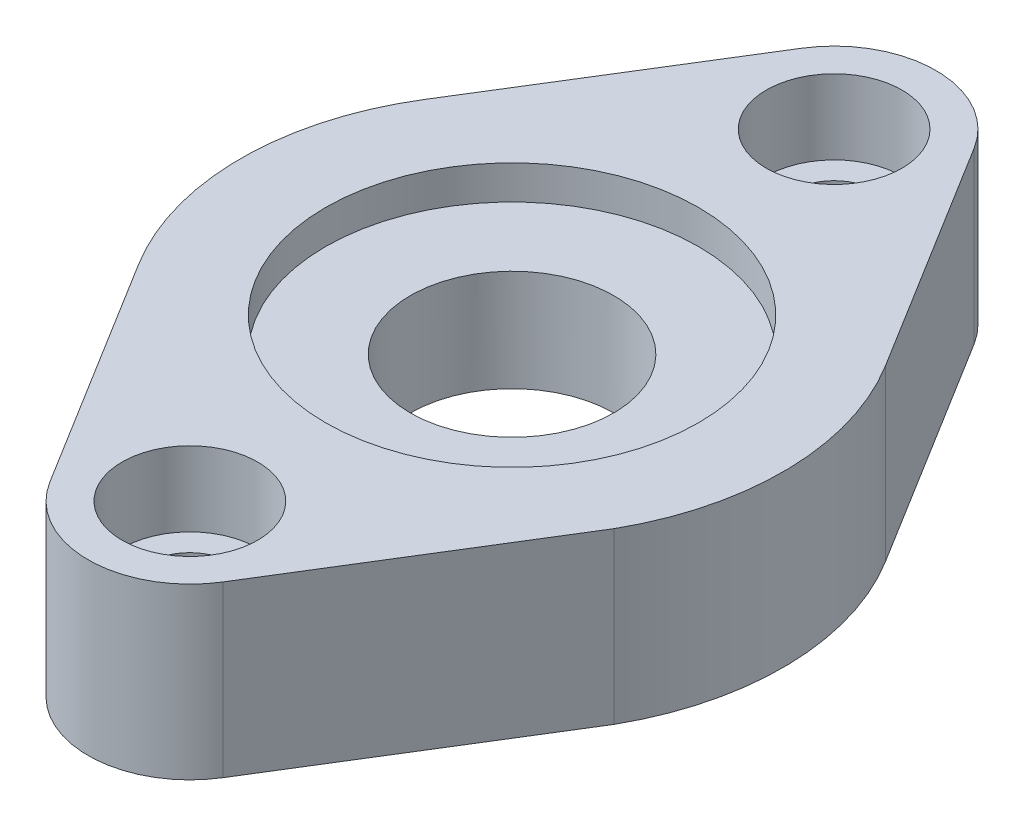
ISO-10303-21;
HEADER;
FILE_DESCRIPTION(('STEP AP214'),'2;1');
FILE_NAME('part.step','',(''),(''),'','','');
FILE_SCHEMA(('AUTOMOTIVE_DESIGN { 1 0 10303 214 1 1 1 1 }'));
ENDSEC;
DATA;
#1=APPLICATION_CONTEXT('core data for automotive mechanical design processes');
#2=APPLICATION_PROTOCOL_DEFINITION('international standard','automotive_design',2000,#1);
#3=PRODUCT_CONTEXT('',#1,'mechanical');
#4=PRODUCT('Part','Part','',(#3));
#5=PRODUCT_RELATED_PRODUCT_CATEGORY('part','',(#4));
#6=PRODUCT_DEFINITION_FORMATION('','',#4);
#7=PRODUCT_DEFINITION_CONTEXT('part definition',#1,'design');
#8=PRODUCT_DEFINITION('design','',#6,#7);
#9=PRODUCT_DEFINITION_SHAPE('','',#8);
#10=(LENGTH_UNIT() NAMED_UNIT(*) SI_UNIT(.MILLI.,.METRE.));
#11=(NAMED_UNIT(*) PLANE_ANGLE_UNIT() SI_UNIT($,.RADIAN.));
#12=(NAMED_UNIT(*) SI_UNIT($,.STERADIAN.) SOLID_ANGLE_UNIT());
#13=UNCERTAINTY_MEASURE_WITH_UNIT(LENGTH_MEASURE(1.E-05),#10,'distance_accuracy_value','');
#14=(GEOMETRIC_REPRESENTATION_CONTEXT(3) GLOBAL_UNCERTAINTY_ASSIGNED_CONTEXT((#13)) GLOBAL_UNIT_ASSIGNED_CONTEXT((#10,
#11,#12)) REPRESENTATION_CONTEXT('',''));
#15=CARTESIAN_POINT('',(0.,0.,0.));
#16=DIRECTION('',(0.,0.,1.));
#17=DIRECTION('',(1.,0.,0.));
#18=AXIS2_PLACEMENT_3D('',#15,#16,#17);
#19=CARTESIAN_POINT('',(0.,-0.000999999999999265,0.));
#20=DIRECTION('',(0.,1.,0.));
#21=DIRECTION('',(0.,0.,1.));
#22=AXIS2_PLACEMENT_3D('',#19,#20,#21);
#23=CYLINDRICAL_SURFACE('',#22,6.);
#24=CARTESIAN_POINT('',(0.,8.,0.));
#25=DIRECTION('',(0.,1.,0.));
#26=DIRECTION('',(0.,0.,1.));
#27=AXIS2_PLACEMENT_3D('',#24,#25,#26);
#28=CIRCLE('',#27,6.);
#29=CARTESIAN_POINT('',(0.,8.,6.));
#30=VERTEX_POINT('',#29);
#31=EDGE_CURVE('E212',#30,#30,#28,.T.);
#32=ORIENTED_EDGE('',*,*,#31,.T.);
#33=EDGE_LOOP('',(#32));
#34=FACE_BOUND('',#33,.T.);
#35=CARTESIAN_POINT('',(0.,2.,0.));
#36=DIRECTION('',(0.,-1.,0.));
#37=DIRECTION('',(0.,0.,-1.));
#38=AXIS2_PLACEMENT_3D('',#35,#36,#37);
#39=CIRCLE('',#38,6.);
#40=CARTESIAN_POINT('',(0.,2.,-6.));
#41=VERTEX_POINT('',#40);
#42=EDGE_CURVE('E42',#41,#41,#39,.F.);
#43=ORIENTED_EDGE('',*,*,#42,.F.);
#44=EDGE_LOOP('',(#43));
#45=FACE_BOUND('',#44,.T.);
#46=ADVANCED_FACE('F38',(#34,#45),#23,.F.);
#47=CARTESIAN_POINT('',(-0.0012658460579653,10.,0.00184899376610635));
#48=DIRECTION('',(0.,-1.,0.));
#49=DIRECTION('',(0.,0.,-1.));
#50=AXIS2_PLACEMENT_3D('',#47,#48,#49);
#51=CYLINDRICAL_SURFACE('',#50,16.0000844481188);
#52=CARTESIAN_POINT('',(-0.0012658460579653,0.,0.00184899376610635));
#53=DIRECTION('',(0.,1.,0.));
#54=DIRECTION('',(0.,0.,1.));
#55=AXIS2_PLACEMENT_3D('',#52,#53,#54);
#56=CIRCLE('',#55,16.0000844481188);
#57=CARTESIAN_POINT('',(13.912148596547,0.,7.90245662199601));
#58=VERTEX_POINT('',#57);
#59=CARTESIAN_POINT('',(13.6034825018068,0.,-8.41916785327805));
#60=VERTEX_POINT('',#59);
#61=EDGE_CURVE('E136',#58,#60,#56,.T.);
#62=ORIENTED_EDGE('',*,*,#61,.T.);
#63=DIRECTION('',(0.,-1.,0.));
#64=VECTOR('',#63,1.);
#65=CARTESIAN_POINT('',(13.6034825018068,10.,-8.41916785327805));
#66=LINE('',#65,#64);
#67=CARTESIAN_POINT('',(13.6034825018068,10.,-8.41916785327805));
#68=VERTEX_POINT('',#67);
#69=EDGE_CURVE('E11',#68,#60,#66,.T.);
#70=ORIENTED_EDGE('',*,*,#69,.F.);
#71=CARTESIAN_POINT('',(-0.0012658460579653,10.,0.00184899376610635));
#72=DIRECTION('',(0.,1.,0.));
#73=DIRECTION('',(0.,0.,1.));
#74=AXIS2_PLACEMENT_3D('',#71,#72,#73);
#75=CIRCLE('',#74,16.0000844481188);
#76=CARTESIAN_POINT('',(13.912148596547,10.,7.90245662199601));
#77=VERTEX_POINT('',#76);
#78=EDGE_CURVE('E151',#77,#68,#75,.T.);
#79=ORIENTED_EDGE('',*,*,#78,.F.);
#80=DIRECTION('',(0.,-1.,0.));
#81=VECTOR('',#80,1.);
#82=CARTESIAN_POINT('',(13.912148596547,10.,7.90245662199601));
#83=LINE('',#82,#81);
#84=EDGE_CURVE('E132',#77,#58,#83,.T.);
#85=ORIENTED_EDGE('',*,*,#84,.T.);
#86=EDGE_LOOP('',(#62,#70,#79,#85));
#87=FACE_BOUND('',#86,.T.);
#88=ADVANCED_FACE('F40',(#87),#51,.T.);
#89=CARTESIAN_POINT('',(5.10059070221827,10.,-22.1560099650156));
#90=DIRECTION('',(-0.85028918021674,0.,0.526315789242869));
#91=DIRECTION('',(0.526315789242869,0.,0.85028918021674));
#92=AXIS2_PLACEMENT_3D('',#89,#90,#91);
#93=PLANE('',#92);
#94=DIRECTION('',(-0.526315789242869,0.,-0.85028918021674));
#95=VECTOR('',#94,1.);
#96=CARTESIAN_POINT('',(5.10059070221827,0.,-22.1560099650156));
#97=LINE('',#96,#95);
#98=CARTESIAN_POINT('',(5.10059070221827,0.,-22.1560099650156));
#99=VERTEX_POINT('',#98);
#100=EDGE_CURVE('E139',#60,#99,#97,.T.);
#101=ORIENTED_EDGE('',*,*,#100,.T.);
#102=DIRECTION('',(0.,-1.,0.));
#103=VECTOR('',#102,1.);
#104=CARTESIAN_POINT('',(5.10059070221827,10.,-22.1560099650156));
#105=LINE('',#104,#103);
#106=CARTESIAN_POINT('',(5.10059070221827,10.,-22.1560099650156));
#107=VERTEX_POINT('',#106);
#108=EDGE_CURVE('E48',#107,#99,#105,.T.);
#109=ORIENTED_EDGE('',*,*,#108,.F.);
#110=DIRECTION('',(-0.526315789242869,0.,-0.85028918021674));
#111=VECTOR('',#110,1.);
#112=CARTESIAN_POINT('',(5.10059070221827,10.,-22.1560099650156));
#113=LINE('',#112,#111);
#114=EDGE_CURVE('E99',#68,#107,#113,.T.);
#115=ORIENTED_EDGE('',*,*,#114,.F.);
#116=ORIENTED_EDGE('',*,*,#69,.T.);
#117=EDGE_LOOP('',(#101,#109,#115,#116));
#118=FACE_BOUND('',#117,.T.);
#119=ADVANCED_FACE('F235',(#118),#93,.F.);
#120=CARTESIAN_POINT('',(-0.00121389778695734,10.,-18.9980670863549));
#121=DIRECTION('',(0.,-1.,0.));
#122=DIRECTION('',(0.,0.,-1.));
#123=AXIS2_PLACEMENT_3D('',#120,#121,#122);
#124=CYLINDRICAL_SURFACE('',#123,6.00008444953222);
#125=CARTESIAN_POINT('',(-0.00121389778695734,0.,-18.9980670863549));
#126=DIRECTION('',(0.,1.,0.));
#127=DIRECTION('',(0.,0.,-1.));
#128=AXIS2_PLACEMENT_3D('',#125,#126,#127);
#129=CIRCLE('',#128,6.00008444953222);
#130=CARTESIAN_POINT('',(-5.10301976364808,0.,-22.1560079199652));
#131=VERTEX_POINT('',#130);
#132=EDGE_CURVE('E142',#99,#131,#129,.T.);
#133=ORIENTED_EDGE('',*,*,#132,.T.);
#134=DIRECTION('',(0.,-1.,0.));
#135=VECTOR('',#134,1.);
#136=CARTESIAN_POINT('',(-5.10301976364808,10.,-22.1560079199652));
#137=LINE('',#136,#135);
#138=CARTESIAN_POINT('',(-5.10301976364808,10.,-22.1560079199652));
#139=VERTEX_POINT('',#138);
#140=EDGE_CURVE('E158',#139,#131,#137,.T.);
#141=ORIENTED_EDGE('',*,*,#140,.F.);
#142=CARTESIAN_POINT('',(-0.00121389778695734,10.,-18.9980670863549));
#143=DIRECTION('',(0.,1.,0.));
#144=DIRECTION('',(0.,0.,-1.));
#145=AXIS2_PLACEMENT_3D('',#142,#143,#144);
#146=CIRCLE('',#145,6.00008444953222);
#147=EDGE_CURVE('E167',#107,#139,#146,.T.);
#148=ORIENTED_EDGE('',*,*,#147,.F.);
#149=ORIENTED_EDGE('',*,*,#108,.T.);
#150=EDGE_LOOP('',(#133,#141,#148,#149));
#151=FACE_BOUND('',#150,.T.);
#152=ADVANCED_FACE('F165',(#151),#124,.T.);
#153=CARTESIAN_POINT('',(-5.10301976364808,10.,-22.1560079199652));
#154=DIRECTION('',(0.850289180073869,0.,0.526315789473684));
#155=DIRECTION('',(0.526315789473684,0.,-0.850289180073869));
#156=AXIS2_PLACEMENT_3D('',#153,#154,#155);
#157=PLANE('',#156);
#158=DIRECTION('',(-0.526315789473684,0.,0.850289180073869));
#159=VECTOR('',#158,1.);
#160=CARTESIAN_POINT('',(-5.10301976364808,0.,-22.1560079199652));
#161=LINE('',#160,#159);
#162=CARTESIAN_POINT('',(-13.6059115669656,0.,-8.41916581053581));
#163=VERTEX_POINT('',#162);
#164=EDGE_CURVE('E144',#131,#163,#161,.T.);
#165=ORIENTED_EDGE('',*,*,#164,.T.);
#166=DIRECTION('',(0.,-1.,0.));
#167=VECTOR('',#166,1.);
#168=CARTESIAN_POINT('',(-13.6059115669656,10.,-8.41916581053581));
#169=LINE('',#168,#167);
#170=CARTESIAN_POINT('',(-13.6059115669656,10.,-8.41916581053581));
#171=VERTEX_POINT('',#170);
#172=EDGE_CURVE('E155',#171,#163,#169,.T.);
#173=ORIENTED_EDGE('',*,*,#172,.F.);
#174=DIRECTION('',(-0.526315789473684,0.,0.850289180073869));
#175=VECTOR('',#174,1.);
#176=CARTESIAN_POINT('',(-5.10301976364808,10.,-22.1560079199652));
#177=LINE('',#176,#175);
#178=EDGE_CURVE('E179',#139,#171,#177,.T.);
#179=ORIENTED_EDGE('',*,*,#178,.F.);
#180=ORIENTED_EDGE('',*,*,#140,.T.);
#181=EDGE_LOOP('',(#165,#173,#179,#180));
#182=FACE_BOUND('',#181,.T.);
#183=ADVANCED_FACE('F175',(#182),#157,.F.);
#184=CARTESIAN_POINT('',(-0.0012658460579653,10.,0.00184899376610635));
#185=DIRECTION('',(0.,-1.,0.));
#186=DIRECTION('',(0.,0.,-1.));
#187=AXIS2_PLACEMENT_3D('',#184,#185,#186);
#188=CYLINDRICAL_SURFACE('',#187,15.9999961101771);
#189=CARTESIAN_POINT('',(-0.0012658460579653,0.,0.00184899376610635));
#190=DIRECTION('',(0.,1.,0.));
#191=DIRECTION('',(0.,0.,1.));
#192=AXIS2_PLACEMENT_3D('',#189,#190,#191);
#193=CIRCLE('',#192,15.9999961101771);
#194=CARTESIAN_POINT('',(-13.605722541643,0.,8.42316917195874));
#195=VERTEX_POINT('',#194);
#196=EDGE_CURVE('E146',#163,#195,#193,.T.);
#197=ORIENTED_EDGE('',*,*,#196,.T.);
#198=DIRECTION('',(0.,-1.,0.));
#199=VECTOR('',#198,1.);
#200=CARTESIAN_POINT('',(-13.605722541643,10.,8.42316917195874));
#201=LINE('',#200,#199);
#202=CARTESIAN_POINT('',(-13.605722541643,10.,8.42316917195874));
#203=VERTEX_POINT('',#202);
#204=EDGE_CURVE('E127',#203,#195,#201,.T.);
#205=ORIENTED_EDGE('',*,*,#204,.F.);
#206=CARTESIAN_POINT('',(-0.0012658460579653,10.,0.00184899376610635));
#207=DIRECTION('',(0.,1.,0.));
#208=DIRECTION('',(0.,0.,1.));
#209=AXIS2_PLACEMENT_3D('',#206,#207,#208);
#210=CIRCLE('',#209,15.9999961101771);
#211=EDGE_CURVE('E118',#171,#203,#210,.T.);
#212=ORIENTED_EDGE('',*,*,#211,.F.);
#213=ORIENTED_EDGE('',*,*,#172,.T.);
#214=EDGE_LOOP('',(#197,#205,#212,#213));
#215=FACE_BOUND('',#214,.T.);
#216=ADVANCED_FACE('F178',(#215),#188,.T.);
#217=CARTESIAN_POINT('',(-13.605722541643,10.,8.42316917195875));
#218=DIRECTION('',(0.850281854016254,0.,-0.526327624897916));
#219=DIRECTION('',(-0.526327624897916,0.,-0.850281854016255));
#220=AXIS2_PLACEMENT_3D('',#217,#218,#219);
#221=PLANE('',#220);
#222=DIRECTION('',(0.526327624897916,0.,0.850281854016254));
#223=VECTOR('',#222,1.);
#224=CARTESIAN_POINT('',(-13.605722541643,0.,8.42316917195875));
#225=LINE('',#224,#223);
#226=CARTESIAN_POINT('',(-5.10267553701801,0.,22.1598347579275));
#227=VERTEX_POINT('',#226);
#228=EDGE_CURVE('E126',#195,#227,#225,.T.);
#229=ORIENTED_EDGE('',*,*,#228,.T.);
#230=DIRECTION('',(0.,-1.,0.));
#231=VECTOR('',#230,1.);
#232=CARTESIAN_POINT('',(-5.10267553701801,10.,22.1598347579275));
#233=LINE('',#232,#231);
#234=CARTESIAN_POINT('',(-5.10267553701801,10.,22.1598347579275));
#235=VERTEX_POINT('',#234);
#236=EDGE_CURVE('E123',#235,#227,#233,.T.);
#237=ORIENTED_EDGE('',*,*,#236,.F.);
#238=DIRECTION('',(0.526327624897916,0.,0.850281854016254));
#239=VECTOR('',#238,1.);
#240=CARTESIAN_POINT('',(-13.605722541643,10.,8.42316917195875));
#241=LINE('',#240,#239);
#242=EDGE_CURVE('E112',#203,#235,#241,.T.);
#243=ORIENTED_EDGE('',*,*,#242,.F.);
#244=ORIENTED_EDGE('',*,*,#204,.T.);
#245=EDGE_LOOP('',(#229,#237,#243,#244));
#246=FACE_BOUND('',#245,.T.);
#247=ADVANCED_FACE('F124',(#246),#221,.F.);
#248=CARTESIAN_POINT('',(-0.00104409685265237,10.,19.0019329132658));
#249=DIRECTION('',(0.,-1.,0.));
#250=DIRECTION('',(0.,0.,-1.));
#251=AXIS2_PLACEMENT_3D('',#248,#249,#250);
#252=CYLINDRICAL_SURFACE('',#251,5.99991561705676);
#253=CARTESIAN_POINT('',(-0.00104409685265237,0.,19.0019329132658));
#254=DIRECTION('',(0.,1.,0.));
#255=DIRECTION('',(0.,0.,1.));
#256=AXIS2_PLACEMENT_3D('',#253,#254,#255);
#257=CIRCLE('',#256,5.99991561705676);
#258=CARTESIAN_POINT('',(5.10161433204634,0.,22.1581750411431));
#259=VERTEX_POINT('',#258);
#260=EDGE_CURVE('E85',#227,#259,#257,.T.);
#261=ORIENTED_EDGE('',*,*,#260,.T.);
#262=DIRECTION('',(0.,-1.,0.));
#263=VECTOR('',#262,1.);
#264=CARTESIAN_POINT('',(5.10161433204634,10.,22.1581750411431));
#265=LINE('',#264,#263);
#266=CARTESIAN_POINT('',(5.10161433204634,10.,22.1581750411431));
#267=VERTEX_POINT('',#266);
#268=EDGE_CURVE('E128',#267,#259,#265,.T.);
#269=ORIENTED_EDGE('',*,*,#268,.F.);
#270=CARTESIAN_POINT('',(-0.00104409685265237,10.,19.0019329132658));
#271=DIRECTION('',(0.,1.,0.));
#272=DIRECTION('',(0.,0.,1.));
#273=AXIS2_PLACEMENT_3D('',#270,#271,#272);
#274=CIRCLE('',#273,5.99991561705676);
#275=EDGE_CURVE('E116',#235,#267,#274,.T.);
#276=ORIENTED_EDGE('',*,*,#275,.F.);
#277=ORIENTED_EDGE('',*,*,#236,.T.);
#278=EDGE_LOOP('',(#261,#269,#276,#277));
#279=FACE_BOUND('',#278,.T.);
#280=ADVANCED_FACE('F130',(#279),#252,.T.);
#281=CARTESIAN_POINT('',(5.10161433204634,10.,22.1581750411431));
#282=DIRECTION('',(-0.850650388122401,0.,-0.525731792064364));
#283=DIRECTION('',(-0.525731792064364,0.,0.850650388122401));
#284=AXIS2_PLACEMENT_3D('',#281,#282,#283);
#285=PLANE('',#284);
#286=DIRECTION('',(0.525731792064364,0.,-0.850650388122401));
#287=VECTOR('',#286,1.);
#288=CARTESIAN_POINT('',(5.10161433204634,0.,22.1581750411431));
#289=LINE('',#288,#287);
#290=EDGE_CURVE('E91',#259,#58,#289,.T.);
#291=ORIENTED_EDGE('',*,*,#290,.T.);
#292=ORIENTED_EDGE('',*,*,#84,.F.);
#293=DIRECTION('',(0.525731792064364,0.,-0.850650388122401));
#294=VECTOR('',#293,1.);
#295=CARTESIAN_POINT('',(5.10161433204634,10.,22.1581750411431));
#296=LINE('',#295,#294);
#297=EDGE_CURVE('E56',#267,#77,#296,.T.);
#298=ORIENTED_EDGE('',*,*,#297,.F.);
#299=ORIENTED_EDGE('',*,*,#268,.T.);
#300=EDGE_LOOP('',(#291,#292,#298,#299));
#301=FACE_BOUND('',#300,.T.);
#302=ADVANCED_FACE('F275',(#301),#285,.F.);
#303=CARTESIAN_POINT('',(-0.0012658460579653,10.,0.00184899376610635));
#304=DIRECTION('',(0.,1.,0.));
#305=DIRECTION('',(0.,0.,1.));
#306=AXIS2_PLACEMENT_3D('',#303,#304,#305);
#307=PLANE('',#306);
#308=CARTESIAN_POINT('',(0.,10.,0.));
#309=DIRECTION('',(0.,1.,0.));
#310=DIRECTION('',(0.,0.,1.));
#311=AXIS2_PLACEMENT_3D('',#308,#309,#310);
#312=CIRCLE('',#311,11.);
#313=CARTESIAN_POINT('',(0.,10.,11.));
#314=VERTEX_POINT('',#313);
#315=EDGE_CURVE('E209',#314,#314,#312,.T.);
#316=ORIENTED_EDGE('',*,*,#315,.F.);
#317=EDGE_LOOP('',(#316));
#318=FACE_BOUND('',#317,.T.);
#319=CARTESIAN_POINT('',(-0.00121389778695734,10.,-18.9980670863549));
#320=DIRECTION('',(0.,1.,0.));
#321=DIRECTION('',(0.,0.,1.));
#322=AXIS2_PLACEMENT_3D('',#319,#320,#321);
#323=CIRCLE('',#322,3.99997531016157);
#324=CARTESIAN_POINT('',(-0.00121389778695734,10.,-14.9980917761933));
#325=VERTEX_POINT('',#324);
#326=EDGE_CURVE('E192',#325,#325,#323,.T.);
#327=ORIENTED_EDGE('',*,*,#326,.F.);
#328=EDGE_LOOP('',(#327));
#329=FACE_BOUND('',#328,.T.);
#330=CARTESIAN_POINT('',(-6.82170363509448E-05,10.,19.0018484509596));
#331=DIRECTION('',(0.,1.,0.));
#332=DIRECTION('',(0.,0.,1.));
#333=AXIS2_PLACEMENT_3D('',#330,#331,#332);
#334=CIRCLE('',#333,4.);
#335=CARTESIAN_POINT('',(-6.82170363509448E-05,10.,23.0018484509596));
#336=VERTEX_POINT('',#335);
#337=EDGE_CURVE('E188',#336,#336,#334,.T.);
#338=ORIENTED_EDGE('',*,*,#337,.F.);
#339=EDGE_LOOP('',(#338));
#340=FACE_BOUND('',#339,.T.);
#341=ORIENTED_EDGE('',*,*,#78,.T.);
#342=ORIENTED_EDGE('',*,*,#114,.T.);
#343=ORIENTED_EDGE('',*,*,#147,.T.);
#344=ORIENTED_EDGE('',*,*,#178,.T.);
#345=ORIENTED_EDGE('',*,*,#211,.T.);
#346=ORIENTED_EDGE('',*,*,#242,.T.);
#347=ORIENTED_EDGE('',*,*,#275,.T.);
#348=ORIENTED_EDGE('',*,*,#297,.T.);
#349=EDGE_LOOP('',(#341,#342,#343,#344,#345,#346,#347,#348));
#350=FACE_BOUND('',#349,.T.);
#351=ADVANCED_FACE('F114',(#318,#329,#340,#350),#307,.T.);
#352=CARTESIAN_POINT('',(-0.0012658460579653,0.,0.00184899376610635));
#353=DIRECTION('',(0.,1.,0.));
#354=DIRECTION('',(0.,0.,1.));
#355=AXIS2_PLACEMENT_3D('',#352,#353,#354);
#356=PLANE('',#355);
#357=CARTESIAN_POINT('',(0.,0.,0.));
#358=DIRECTION('',(0.,-1.,0.));
#359=DIRECTION('',(0.,0.,-1.));
#360=AXIS2_PLACEMENT_3D('',#357,#358,#359);
#361=CIRCLE('',#360,11.);
#362=CARTESIAN_POINT('',(0.,0.,-11.));
#363=VERTEX_POINT('',#362);
#364=EDGE_CURVE('E217',#363,#363,#361,.T.);
#365=ORIENTED_EDGE('',*,*,#364,.F.);
#366=EDGE_LOOP('',(#365));
#367=FACE_BOUND('',#366,.T.);
#368=CARTESIAN_POINT('',(-0.00121389778695734,0.,-18.9980670863549));
#369=DIRECTION('',(0.,1.,0.));
#370=DIRECTION('',(0.,0.,1.));
#371=AXIS2_PLACEMENT_3D('',#368,#369,#370);
#372=CIRCLE('',#371,2.5);
#373=CARTESIAN_POINT('',(-0.00121389778695734,0.,-16.4980670863549));
#374=VERTEX_POINT('',#373);
#375=EDGE_CURVE('E189',#374,#374,#372,.F.);
#376=ORIENTED_EDGE('',*,*,#375,.F.);
#377=EDGE_LOOP('',(#376));
#378=FACE_BOUND('',#377,.T.);
#379=CARTESIAN_POINT('',(-6.82170363509448E-05,0.,19.0018484509596));
#380=DIRECTION('',(0.,1.,0.));
#381=DIRECTION('',(0.,0.,1.));
#382=AXIS2_PLACEMENT_3D('',#379,#380,#381);
#383=CIRCLE('',#382,2.5);
#384=CARTESIAN_POINT('',(-6.82170363509448E-05,0.,21.5018484509596));
#385=VERTEX_POINT('',#384);
#386=EDGE_CURVE('E201',#385,#385,#383,.F.);
#387=ORIENTED_EDGE('',*,*,#386,.F.);
#388=EDGE_LOOP('',(#387));
#389=FACE_BOUND('',#388,.T.);
#390=ORIENTED_EDGE('',*,*,#61,.F.);
#391=ORIENTED_EDGE('',*,*,#290,.F.);
#392=ORIENTED_EDGE('',*,*,#260,.F.);
#393=ORIENTED_EDGE('',*,*,#228,.F.);
#394=ORIENTED_EDGE('',*,*,#196,.F.);
#395=ORIENTED_EDGE('',*,*,#164,.F.);
#396=ORIENTED_EDGE('',*,*,#132,.F.);
#397=ORIENTED_EDGE('',*,*,#100,.F.);
#398=EDGE_LOOP('',(#390,#391,#392,#393,#394,#395,#396,#397));
#399=FACE_BOUND('',#398,.T.);
#400=ADVANCED_FACE('F171',(#367,#378,#389,#399),#356,.F.);
#401=CARTESIAN_POINT('',(-6.82170363509448E-05,5.6,19.0018484509596));
#402=DIRECTION('',(0.,1.,0.));
#403=DIRECTION('',(0.,0.,1.));
#404=AXIS2_PLACEMENT_3D('',#401,#402,#403);
#405=CYLINDRICAL_SURFACE('',#404,4.);
#406=CARTESIAN_POINT('',(-6.82170363509448E-05,5.6,19.0018484509596));
#407=DIRECTION('',(0.,1.,0.));
#408=DIRECTION('',(0.,0.,1.));
#409=AXIS2_PLACEMENT_3D('',#406,#407,#408);
#410=CIRCLE('',#409,4.);
#411=CARTESIAN_POINT('',(-6.82170363509448E-05,5.6,23.0018484509596));
#412=VERTEX_POINT('',#411);
#413=EDGE_CURVE('E185',#412,#412,#410,.T.);
#414=ORIENTED_EDGE('',*,*,#413,.F.);
#415=EDGE_LOOP('',(#414));
#416=FACE_BOUND('',#415,.T.);
#417=ORIENTED_EDGE('',*,*,#337,.T.);
#418=EDGE_LOOP('',(#417));
#419=FACE_BOUND('',#418,.T.);
#420=ADVANCED_FACE('F266',(#416,#419),#405,.F.);
#421=CARTESIAN_POINT('',(-6.82170363509448E-05,5.6,19.0018484509596));
#422=DIRECTION('',(0.,1.,0.));
#423=DIRECTION('',(0.,0.,1.));
#424=AXIS2_PLACEMENT_3D('',#421,#422,#423);
#425=PLANE('',#424);
#426=CARTESIAN_POINT('',(-6.82170363509448E-05,5.6,19.0018484509596));
#427=DIRECTION('',(0.,1.,0.));
#428=DIRECTION('',(0.,0.,1.));
#429=AXIS2_PLACEMENT_3D('',#426,#427,#428);
#430=CIRCLE('',#429,2.5);
#431=CARTESIAN_POINT('',(-6.82170363509448E-05,5.6,21.5018484509596));
#432=VERTEX_POINT('',#431);
#433=EDGE_CURVE('E197',#432,#432,#430,.T.);
#434=ORIENTED_EDGE('',*,*,#433,.F.);
#435=EDGE_LOOP('',(#434));
#436=FACE_BOUND('',#435,.T.);
#437=ORIENTED_EDGE('',*,*,#413,.T.);
#438=EDGE_LOOP('',(#437));
#439=FACE_BOUND('',#438,.T.);
#440=ADVANCED_FACE('F264',(#436,#439),#425,.T.);
#441=CARTESIAN_POINT('',(-0.00121389778695734,5.6,-18.9980670863549));
#442=DIRECTION('',(0.,1.,0.));
#443=DIRECTION('',(0.,0.,1.));
#444=AXIS2_PLACEMENT_3D('',#441,#442,#443);
#445=CYLINDRICAL_SURFACE('',#444,3.99997531016157);
#446=CARTESIAN_POINT('',(-0.00121389778695734,5.6,-18.9980670863549));
#447=DIRECTION('',(0.,1.,0.));
#448=DIRECTION('',(0.,0.,1.));
#449=AXIS2_PLACEMENT_3D('',#446,#447,#448);
#450=CIRCLE('',#449,3.99997531016157);
#451=CARTESIAN_POINT('',(-0.00121389778695734,5.6,-14.9980917761933));
#452=VERTEX_POINT('',#451);
#453=EDGE_CURVE('E140',#452,#452,#450,.T.);
#454=ORIENTED_EDGE('',*,*,#453,.F.);
#455=EDGE_LOOP('',(#454));
#456=FACE_BOUND('',#455,.T.);
#457=ORIENTED_EDGE('',*,*,#326,.T.);
#458=EDGE_LOOP('',(#457));
#459=FACE_BOUND('',#458,.T.);
#460=ADVANCED_FACE('F260',(#456,#459),#445,.F.);
#461=CARTESIAN_POINT('',(-0.00121389778695734,5.6,-18.9980670863549));
#462=DIRECTION('',(0.,1.,0.));
#463=DIRECTION('',(0.,0.,1.));
#464=AXIS2_PLACEMENT_3D('',#461,#462,#463);
#465=PLANE('',#464);
#466=CARTESIAN_POINT('',(-0.00121389778695734,5.6,-18.9980670863549));
#467=DIRECTION('',(0.,1.,0.));
#468=DIRECTION('',(0.,0.,1.));
#469=AXIS2_PLACEMENT_3D('',#466,#467,#468);
#470=CIRCLE('',#469,2.5);
#471=CARTESIAN_POINT('',(-0.00121389778695734,5.6,-16.4980670863549));
#472=VERTEX_POINT('',#471);
#473=EDGE_CURVE('E200',#472,#472,#470,.T.);
#474=ORIENTED_EDGE('',*,*,#473,.F.);
#475=EDGE_LOOP('',(#474));
#476=FACE_BOUND('',#475,.T.);
#477=ORIENTED_EDGE('',*,*,#453,.T.);
#478=EDGE_LOOP('',(#477));
#479=FACE_BOUND('',#478,.T.);
#480=ADVANCED_FACE('F256',(#476,#479),#465,.T.);
#481=CARTESIAN_POINT('',(-6.82170363509448E-05,-0.00100000000000013,19.0018484509596));
#482=DIRECTION('',(0.,1.,0.));
#483=DIRECTION('',(0.,0.,1.));
#484=AXIS2_PLACEMENT_3D('',#481,#482,#483);
#485=CYLINDRICAL_SURFACE('',#484,2.5);
#486=ORIENTED_EDGE('',*,*,#433,.T.);
#487=EDGE_LOOP('',(#486));
#488=FACE_BOUND('',#487,.T.);
#489=ORIENTED_EDGE('',*,*,#386,.T.);
#490=EDGE_LOOP('',(#489));
#491=FACE_BOUND('',#490,.T.);
#492=ADVANCED_FACE('F252',(#488,#491),#485,.F.);
#493=CARTESIAN_POINT('',(-0.00121389778695734,-0.00100000000000013,-18.9980670863549));
#494=DIRECTION('',(0.,1.,0.));
#495=DIRECTION('',(0.,0.,1.));
#496=AXIS2_PLACEMENT_3D('',#493,#494,#495);
#497=CYLINDRICAL_SURFACE('',#496,2.5);
#498=ORIENTED_EDGE('',*,*,#473,.T.);
#499=EDGE_LOOP('',(#498));
#500=FACE_BOUND('',#499,.T.);
#501=ORIENTED_EDGE('',*,*,#375,.T.);
#502=EDGE_LOOP('',(#501));
#503=FACE_BOUND('',#502,.T.);
#504=ADVANCED_FACE('F248',(#500,#503),#497,.F.);
#505=CARTESIAN_POINT('',(0.,8.,0.));
#506=DIRECTION('',(0.,1.,0.));
#507=DIRECTION('',(0.,0.,1.));
#508=AXIS2_PLACEMENT_3D('',#505,#506,#507);
#509=CYLINDRICAL_SURFACE('',#508,11.);
#510=CARTESIAN_POINT('',(0.,8.,0.));
#511=DIRECTION('',(0.,1.,0.));
#512=DIRECTION('',(0.,0.,1.));
#513=AXIS2_PLACEMENT_3D('',#510,#511,#512);
#514=CIRCLE('',#513,11.);
#515=CARTESIAN_POINT('',(0.,8.,11.));
#516=VERTEX_POINT('',#515);
#517=EDGE_CURVE('E204',#516,#516,#514,.T.);
#518=ORIENTED_EDGE('',*,*,#517,.F.);
#519=EDGE_LOOP('',(#518));
#520=FACE_BOUND('',#519,.T.);
#521=ORIENTED_EDGE('',*,*,#315,.T.);
#522=EDGE_LOOP('',(#521));
#523=FACE_BOUND('',#522,.T.);
#524=ADVANCED_FACE('F244',(#520,#523),#509,.F.);
#525=CARTESIAN_POINT('',(0.,8.,0.));
#526=DIRECTION('',(0.,1.,0.));
#527=DIRECTION('',(0.,0.,1.));
#528=AXIS2_PLACEMENT_3D('',#525,#526,#527);
#529=PLANE('',#528);
#530=ORIENTED_EDGE('',*,*,#31,.F.);
#531=EDGE_LOOP('',(#530));
#532=FACE_BOUND('',#531,.T.);
#533=ORIENTED_EDGE('',*,*,#517,.T.);
#534=EDGE_LOOP('',(#533));
#535=FACE_BOUND('',#534,.T.);
#536=ADVANCED_FACE('F241',(#532,#535),#529,.T.);
#537=CARTESIAN_POINT('',(0.,2.,0.));
#538=DIRECTION('',(0.,-1.,0.));
#539=DIRECTION('',(0.,0.,-1.));
#540=AXIS2_PLACEMENT_3D('',#537,#538,#539);
#541=PLANE('',#540);
#542=CARTESIAN_POINT('',(0.,2.,0.));
#543=DIRECTION('',(0.,-1.,0.));
#544=DIRECTION('',(0.,0.,-1.));
#545=AXIS2_PLACEMENT_3D('',#542,#543,#544);
#546=CIRCLE('',#545,11.);
#547=CARTESIAN_POINT('',(0.,2.,-11.));
#548=VERTEX_POINT('',#547);
#549=EDGE_CURVE('E220',#548,#548,#546,.T.);
#550=ORIENTED_EDGE('',*,*,#549,.T.);
#551=EDGE_LOOP('',(#550));
#552=FACE_BOUND('',#551,.T.);
#553=ORIENTED_EDGE('',*,*,#42,.T.);
#554=EDGE_LOOP('',(#553));
#555=FACE_BOUND('',#554,.T.);
#556=ADVANCED_FACE('F227',(#552,#555),#541,.T.);
#557=CARTESIAN_POINT('',(0.,2.,0.));
#558=DIRECTION('',(0.,-1.,0.));
#559=DIRECTION('',(0.,0.,-1.));
#560=AXIS2_PLACEMENT_3D('',#557,#558,#559);
#561=CYLINDRICAL_SURFACE('',#560,11.);
#562=ORIENTED_EDGE('',*,*,#549,.F.);
#563=EDGE_LOOP('',(#562));
#564=FACE_BOUND('',#563,.T.);
#565=ORIENTED_EDGE('',*,*,#364,.T.);
#566=EDGE_LOOP('',(#565));
#567=FACE_BOUND('',#566,.T.);
#568=ADVANCED_FACE('F239',(#564,#567),#561,.F.);
#569=CLOSED_SHELL('',(#46,#88,#119,#152,#183,#216,#247,#280,#302,#351,#400,#420,#440,#460,#480,
#492,#504,#524,#536,#556,#568));
#570=MANIFOLD_SOLID_BREP('B2',#569);
#571=ADVANCED_BREP_SHAPE_REPRESENTATION('',(#18,#570),#14);
#572=SHAPE_DEFINITION_REPRESENTATION(#9,#571);
ENDSEC;
END-ISO-10303-21;
